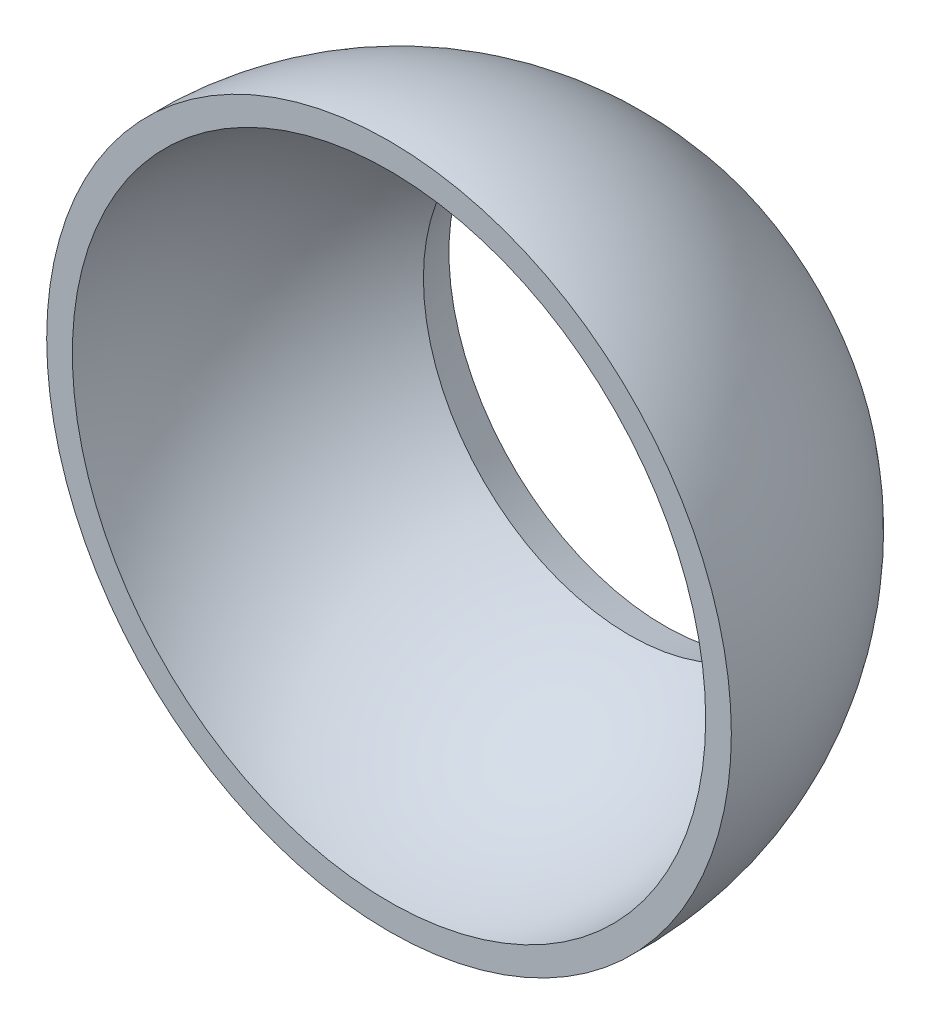
ISO-10303-21;
HEADER;
FILE_DESCRIPTION(('STEP AP214'),'2;1');
FILE_NAME('part.step','',(''),(''),'','','');
FILE_SCHEMA(('AUTOMOTIVE_DESIGN { 1 0 10303 214 1 1 1 1 }'));
ENDSEC;
DATA;
#1=APPLICATION_CONTEXT('core data for automotive mechanical design processes');
#2=APPLICATION_PROTOCOL_DEFINITION('international standard','automotive_design',2000,#1);
#3=PRODUCT_CONTEXT('',#1,'mechanical');
#4=PRODUCT('Part','Part','',(#3));
#5=PRODUCT_RELATED_PRODUCT_CATEGORY('part','',(#4));
#6=PRODUCT_DEFINITION_FORMATION('','',#4);
#7=PRODUCT_DEFINITION_CONTEXT('part definition',#1,'design');
#8=PRODUCT_DEFINITION('design','',#6,#7);
#9=PRODUCT_DEFINITION_SHAPE('','',#8);
#10=(LENGTH_UNIT() NAMED_UNIT(*) SI_UNIT(.MILLI.,.METRE.));
#11=(NAMED_UNIT(*) PLANE_ANGLE_UNIT() SI_UNIT($,.RADIAN.));
#12=(NAMED_UNIT(*) SI_UNIT($,.STERADIAN.) SOLID_ANGLE_UNIT());
#13=UNCERTAINTY_MEASURE_WITH_UNIT(LENGTH_MEASURE(1.E-05),#10,'distance_accuracy_value','');
#14=(GEOMETRIC_REPRESENTATION_CONTEXT(3) GLOBAL_UNCERTAINTY_ASSIGNED_CONTEXT((#13)) GLOBAL_UNIT_ASSIGNED_CONTEXT((#10,
#11,#12)) REPRESENTATION_CONTEXT('',''));
#15=CARTESIAN_POINT('',(0.,0.,0.));
#16=DIRECTION('',(0.,0.,1.));
#17=DIRECTION('',(1.,0.,0.));
#18=AXIS2_PLACEMENT_3D('',#15,#16,#17);
#19=CARTESIAN_POINT('',(0.,0.,50.2178144018879));
#20=DIRECTION('',(0.,0.,1.));
#21=DIRECTION('',(1.,0.,0.));
#22=AXIS2_PLACEMENT_3D('',#19,#20,#21);
#23=SPHERICAL_SURFACE('',#22,11.341714842274);
#24=CARTESIAN_POINT('',(0.,0.,41.4177876653685));
#25=DIRECTION('',(0.,0.,1.));
#26=DIRECTION('',(1.,0.,0.));
#27=AXIS2_PLACEMENT_3D('',#24,#25,#26);
#28=CIRCLE('',#27,7.155);
#29=CARTESIAN_POINT('',(7.155,0.,41.4177876653685));
#30=VERTEX_POINT('',#29);
#31=EDGE_CURVE('E60',#30,#30,#28,.T.);
#32=CARTESIAN_POINT('',(0.,0.,50.5571712511994));
#33=DIRECTION('',(0.,0.,1.));
#34=DIRECTION('',(1.,0.,0.));
#35=AXIS2_PLACEMENT_3D('',#32,#33,#34);
#36=CIRCLE('',#35,11.3366367363642);
#37=CARTESIAN_POINT('',(11.3366367363642,0.,50.5571712511994));
#38=VERTEX_POINT('',#37);
#39=EDGE_CURVE('E10',#38,#38,#36,.T.);
#40=CARTESIAN_POINT('',(7.155,0.,41.4177876653685));
#41=CARTESIAN_POINT('',(7.239156486266,0.,41.4862118262759));
#42=CARTESIAN_POINT('',(7.32233085194075,0.,41.5558438737391));
#43=CARTESIAN_POINT('',(7.48664820550357,0.,41.6974649024617));
#44=CARTESIAN_POINT('',(7.56779119339163,0.,41.7694538837212));
#45=CARTESIAN_POINT('',(7.72797865477685,0.,41.9157299407209));
#46=CARTESIAN_POINT('',(7.80702312827401,0.,41.9900170164612));
#47=CARTESIAN_POINT('',(7.96294859939954,0.,42.1408280119251));
#48=CARTESIAN_POINT('',(8.03982959702791,0.,42.2173519316487));
#49=CARTESIAN_POINT('',(8.19136481551205,0.,42.3725736628606));
#50=CARTESIAN_POINT('',(8.26601903636783,0.,42.4512714743489));
#51=CARTESIAN_POINT('',(8.41303926527557,0.,42.6107762103705));
#52=CARTESIAN_POINT('',(8.48540527332754,0.,42.6915831349037));
#53=CARTESIAN_POINT('',(8.62778951525112,0.,42.8552395924269));
#54=CARTESIAN_POINT('',(8.69780774912271,0.,42.9380891254167));
#55=CARTESIAN_POINT('',(8.83543881591197,0.,43.1057626114529));
#56=CARTESIAN_POINT('',(8.90305164882962,0.,43.1905865644991));
#57=CARTESIAN_POINT('',(9.03581626604112,0.,43.3621390779545));
#58=CARTESIAN_POINT('',(9.10096805033496,0.,43.4488676383636));
#59=CARTESIAN_POINT('',(9.22875694831704,0.,43.6241579861054));
#60=CARTESIAN_POINT('',(9.29139406200527,0.,43.7127197734382));
#61=CARTESIAN_POINT('',(9.41410206640481,0.,43.8916036858349));
#62=CARTESIAN_POINT('',(9.47417295711612,0.,43.9819258108989));
#63=CARTESIAN_POINT('',(9.59169907528655,0.,44.1642560607373));
#64=CARTESIAN_POINT('',(9.64915430274567,0.,44.2562641855117));
#65=CARTESIAN_POINT('',(9.76140180690839,0.,44.4418907091217));
#66=CARTESIAN_POINT('',(9.81619408361198,0.,44.5355091079572));
#67=CARTESIAN_POINT('',(9.92307059045539,0.,44.7242791287318));
#68=CARTESIAN_POINT('',(9.9751548205952,0.,44.8194307506708));
#69=CARTESIAN_POINT('',(10.0765723673121,0.,45.0111889048031));
#70=CARTESIAN_POINT('',(10.1259056838892,0.,45.1077954369963));
#71=CARTESIAN_POINT('',(10.2217808005722,0.,45.3023839013494));
#72=CARTESIAN_POINT('',(10.2683226006782,0.,45.4003658335093));
#73=CARTESIAN_POINT('',(10.3585763790185,0.,45.5976244555099));
#74=CARTESIAN_POINT('',(10.4022883572528,0.,45.6969011453506));
#75=CARTESIAN_POINT('',(10.4868465154839,0.,45.8966675747997));
#76=CARTESIAN_POINT('',(10.5276926954807,0.,45.9971573144081));
#77=CARTESIAN_POINT('',(10.6064856395151,0.,46.1992671371003));
#78=CARTESIAN_POINT('',(10.6444324035526,0.,46.3008872201841));
#79=CARTESIAN_POINT('',(10.7173952842597,0.,46.505174093226));
#80=CARTESIAN_POINT('',(10.7524114009291,0.,46.607840883184));
#81=CARTESIAN_POINT('',(10.8194841675078,0.,46.8141366718995));
#82=CARTESIAN_POINT('',(10.851540817417,0.,46.917765670657));
#83=CARTESIAN_POINT('',(10.912668266821,0.,47.1259005869678));
#84=CARTESIAN_POINT('',(10.9417390663158,0.,47.2304065045211));
#85=CARTESIAN_POINT('',(10.9968708886827,0.,47.4402092466876));
#86=CARTESIAN_POINT('',(11.0229319115549,0.,47.5455060713008));
#87=CARTESIAN_POINT('',(11.0720227316297,0.,47.7568039649091));
#88=CARTESIAN_POINT('',(11.0950525288325,0.,47.8628050339042));
#89=CARTESIAN_POINT('',(11.1380619432501,0.,48.0754241739825));
#90=CARTESIAN_POINT('',(11.1580415604649,0.,48.1820422450657));
#91=CARTESIAN_POINT('',(11.1949341712385,0.,48.3958076392139));
#92=CARTESIAN_POINT('',(11.2118471647973,0.,48.502954962279));
#93=CARTESIAN_POINT('',(11.2425926075728,0.,48.7176906746925));
#94=CARTESIAN_POINT('',(11.2564250567896,0.,48.8252790640408));
#95=CARTESIAN_POINT('',(11.2809980291197,0.,49.0408083603146));
#96=CARTESIAN_POINT('',(11.2917385522329,0.,49.14874926724));
#97=CARTESIAN_POINT('',(11.3101188221483,0.,49.3648947598122));
#98=CARTESIAN_POINT('',(11.3177585689505,0.,49.473099345459));
#99=CARTESIAN_POINT('',(11.3299310373409,0.,49.6896831396631));
#100=CARTESIAN_POINT('',(11.3344637589292,0.,49.7980623482203));
#101=CARTESIAN_POINT('',(11.3404183013075,0.,50.0149061884867));
#102=CARTESIAN_POINT('',(11.3418401220974,0.,50.1233708201959));
#103=CARTESIAN_POINT('',(11.3415722338543,0.,50.34029623755));
#104=CARTESIAN_POINT('',(11.3398825248212,0.,50.4487570231948));
#105=CARTESIAN_POINT('',(11.3366367363642,0.,50.5571712511994));
#106=B_SPLINE_CURVE_WITH_KNOTS('',3,(#40,#41,#42,#43,#44,#45,#46,#47,#48,#49,#50,#51,#52,#53,
#54,#55,#56,#57,#58,#59,#60,#61,#62,#63,#64,#65,#66,#67,#68,#69,#70,#71,#72,#73,#74,#75,#76,#77,
#78,#79,#80,#81,#82,#83,#84,#85,#86,#87,#88,#89,#90,#91,#92,#93,#94,#95,#96,#97,#98,#99,#100,
#101,#102,#103,#104,#105),.UNSPECIFIED.,.F.,.F.,(4,2,2,2,2,2,2,2,2,2,2,2,2,2,2,2,2,2,2,2,2,2,2,
2,2,2,2,2,2,2,2,2,4),(0.,0.325377216176543,0.65075443235309,0.976131648529629,1.30150886470618,
1.62688608088272,1.95226329705926,2.2776405132358,2.60301772941235,2.92839494558889,
3.25377216176544,3.57914937794198,3.90452659411852,4.22990381029507,4.55528102647161,
4.88065824264815,5.2060354588247,5.53141267500124,5.85678989117779,6.18216710735433,
6.50754432353087,6.83292153970741,7.15829875588396,7.4836759720605,7.80905318823705,
8.13443040441359,8.45980762059014,8.78518483676668,9.11056205294322,9.43593926911977,
9.76131648529631,10.0866937014729,10.4120709176494),.UNSPECIFIED.);
#107=EDGE_CURVE('BSEAM43',#30,#38,#106,.T.);
#108=ORIENTED_EDGE('',*,*,#31,.T.);
#109=ORIENTED_EDGE('',*,*,#39,.F.);
#110=ORIENTED_EDGE('',*,*,#107,.T.);
#111=ORIENTED_EDGE('',*,*,#107,.F.);
#112=EDGE_LOOP('',(#108,#110,#109,#111));
#113=FACE_BOUND('',#112,.T.);
#114=ADVANCED_FACE('F43',(#113),#23,.T.);
#115=CARTESIAN_POINT('',(10.4872069258655,0.,50.5571712511994));
#116=DIRECTION('',(0.,0.,1.));
#117=DIRECTION('',(1.,0.,0.));
#118=AXIS2_PLACEMENT_3D('',#115,#116,#117);
#119=PLANE('',#118);
#120=ORIENTED_EDGE('',*,*,#39,.T.);
#121=EDGE_LOOP('',(#120));
#122=FACE_BOUND('',#121,.T.);
#123=CARTESIAN_POINT('',(0.,0.,50.5571712511994));
#124=DIRECTION('',(0.,0.,1.));
#125=DIRECTION('',(1.,0.,0.));
#126=AXIS2_PLACEMENT_3D('',#123,#124,#125);
#127=CIRCLE('',#126,10.4872069258655);
#128=CARTESIAN_POINT('',(10.4872069258655,0.,50.5571712511994));
#129=VERTEX_POINT('',#128);
#130=EDGE_CURVE('E50',#129,#129,#127,.T.);
#131=ORIENTED_EDGE('',*,*,#130,.F.);
#132=EDGE_LOOP('',(#131));
#133=FACE_BOUND('',#132,.T.);
#134=ADVANCED_FACE('F77',(#122,#133),#119,.T.);
#135=CARTESIAN_POINT('',(0.,0.,50.5571712511994));
#136=DIRECTION('',(0.,0.,1.));
#137=DIRECTION('',(1.,0.,0.));
#138=AXIS2_PLACEMENT_3D('',#135,#136,#137);
#139=SPHERICAL_SURFACE('',#138,10.4872069258655);
#140=ORIENTED_EDGE('',*,*,#130,.T.);
#141=EDGE_LOOP('',(#140));
#142=FACE_BOUND('',#141,.T.);
#143=CARTESIAN_POINT('',(0.,0.,42.5940509824712));
#144=DIRECTION('',(0.,0.,1.));
#145=DIRECTION('',(1.,0.,0.));
#146=AXIS2_PLACEMENT_3D('',#143,#144,#145);
#147=CIRCLE('',#146,6.8242380301167);
#148=CARTESIAN_POINT('',(6.8242380301167,0.,42.5940509824712));
#149=VERTEX_POINT('',#148);
#150=EDGE_CURVE('E55',#149,#149,#147,.T.);
#151=ORIENTED_EDGE('',*,*,#150,.F.);
#152=EDGE_LOOP('',(#151));
#153=FACE_BOUND('',#152,.T.);
#154=ADVANCED_FACE('F71',(#142,#153),#139,.F.);
#155=CARTESIAN_POINT('',(0.,0.,41.4177876653685));
#156=DIRECTION('',(0.,0.,-1.));
#157=DIRECTION('',(-1.,0.,0.));
#158=AXIS2_PLACEMENT_3D('',#155,#156,#157);
#159=CONICAL_SURFACE('',#158,7.155,0.274118535548071);
#160=ORIENTED_EDGE('',*,*,#150,.T.);
#161=EDGE_LOOP('',(#160));
#162=FACE_BOUND('',#161,.T.);
#163=ORIENTED_EDGE('',*,*,#31,.F.);
#164=EDGE_LOOP('',(#163));
#165=FACE_BOUND('',#164,.T.);
#166=ADVANCED_FACE('F69',(#162,#165),#159,.F.);
#167=CLOSED_SHELL('',(#114,#134,#154,#166));
#168=MANIFOLD_SOLID_BREP('B2',#167);
#169=ADVANCED_BREP_SHAPE_REPRESENTATION('',(#18,#168),#14);
#170=SHAPE_DEFINITION_REPRESENTATION(#9,#169);
ENDSEC;
END-ISO-10303-21;
